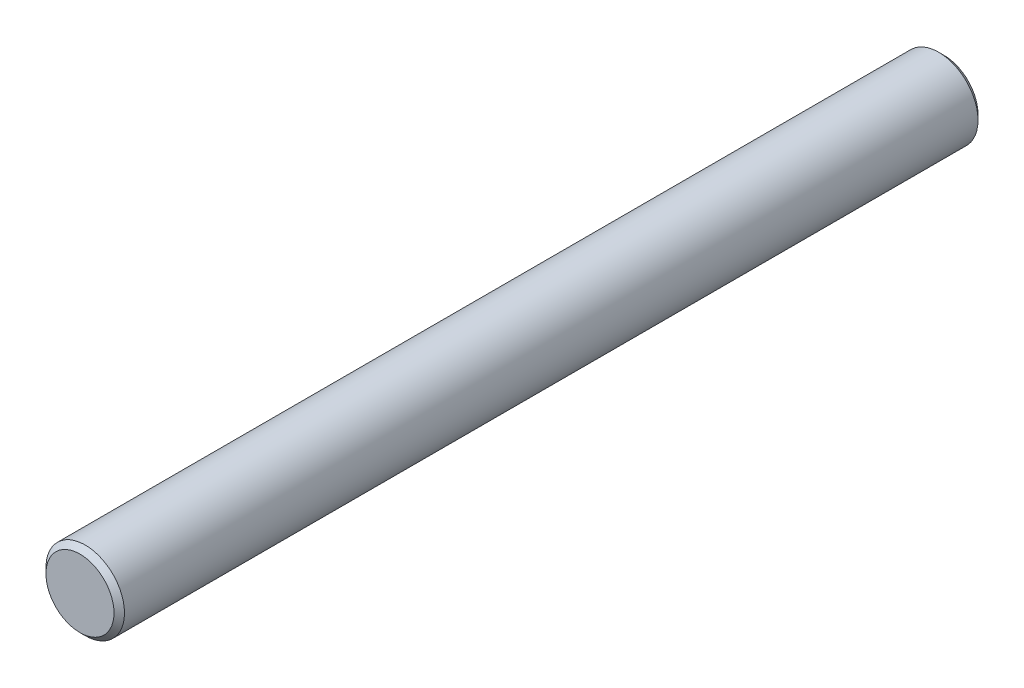
ISO-10303-21;
HEADER;
FILE_DESCRIPTION(('STEP AP214'),'2;1');
FILE_NAME('part.step','',(''),(''),'','','');
FILE_SCHEMA(('AUTOMOTIVE_DESIGN { 1 0 10303 214 1 1 1 1 }'));
ENDSEC;
DATA;
#1=APPLICATION_CONTEXT('core data for automotive mechanical design processes');
#2=APPLICATION_PROTOCOL_DEFINITION('international standard','automotive_design',2000,#1);
#3=PRODUCT_CONTEXT('',#1,'mechanical');
#4=PRODUCT('Part','Part','',(#3));
#5=PRODUCT_RELATED_PRODUCT_CATEGORY('part','',(#4));
#6=PRODUCT_DEFINITION_FORMATION('','',#4);
#7=PRODUCT_DEFINITION_CONTEXT('part definition',#1,'design');
#8=PRODUCT_DEFINITION('design','',#6,#7);
#9=PRODUCT_DEFINITION_SHAPE('','',#8);
#10=(LENGTH_UNIT() NAMED_UNIT(*) SI_UNIT(.MILLI.,.METRE.));
#11=(NAMED_UNIT(*) PLANE_ANGLE_UNIT() SI_UNIT($,.RADIAN.));
#12=(NAMED_UNIT(*) SI_UNIT($,.STERADIAN.) SOLID_ANGLE_UNIT());
#13=UNCERTAINTY_MEASURE_WITH_UNIT(LENGTH_MEASURE(1.E-05),#10,'distance_accuracy_value','');
#14=(GEOMETRIC_REPRESENTATION_CONTEXT(3) GLOBAL_UNCERTAINTY_ASSIGNED_CONTEXT((#13)) GLOBAL_UNIT_ASSIGNED_CONTEXT((#10,
#11,#12)) REPRESENTATION_CONTEXT('',''));
#15=CARTESIAN_POINT('',(0.,0.,0.));
#16=DIRECTION('',(0.,0.,1.));
#17=DIRECTION('',(1.,0.,0.));
#18=AXIS2_PLACEMENT_3D('',#15,#16,#17);
#19=CARTESIAN_POINT('',(0.,0.,33.));
#20=DIRECTION('',(0.,0.,-1.));
#21=DIRECTION('',(-1.,0.,0.));
#22=AXIS2_PLACEMENT_3D('',#19,#20,#21);
#23=CYLINDRICAL_SURFACE('',#22,1.5);
#24=CARTESIAN_POINT('',(0.,0.,0.199999999999999));
#25=DIRECTION('',(0.,0.,1.));
#26=DIRECTION('',(1.,0.,0.));
#27=AXIS2_PLACEMENT_3D('',#24,#25,#26);
#28=CIRCLE('',#27,1.5);
#29=CARTESIAN_POINT('',(1.5,0.,0.199999999999999));
#30=VERTEX_POINT('',#29);
#31=EDGE_CURVE('E42',#30,#30,#28,.T.);
#32=ORIENTED_EDGE('',*,*,#31,.T.);
#33=EDGE_LOOP('',(#32));
#34=FACE_BOUND('',#33,.T.);
#35=CARTESIAN_POINT('',(0.,0.,32.8));
#36=DIRECTION('',(0.,0.,1.));
#37=DIRECTION('',(1.,0.,0.));
#38=AXIS2_PLACEMENT_3D('',#35,#36,#37);
#39=CIRCLE('',#38,1.5);
#40=CARTESIAN_POINT('',(1.5,0.,32.8));
#41=VERTEX_POINT('',#40);
#42=EDGE_CURVE('E46',#41,#41,#39,.F.);
#43=ORIENTED_EDGE('',*,*,#42,.T.);
#44=EDGE_LOOP('',(#43));
#45=FACE_BOUND('',#44,.T.);
#46=ADVANCED_FACE('F31',(#34,#45),#23,.T.);
#47=CARTESIAN_POINT('',(0.,0.,33.));
#48=DIRECTION('',(0.,0.,1.));
#49=DIRECTION('',(1.,0.,0.));
#50=AXIS2_PLACEMENT_3D('',#47,#48,#49);
#51=PLANE('',#50);
#52=CARTESIAN_POINT('',(0.,0.,33.));
#53=DIRECTION('',(0.,0.,1.));
#54=DIRECTION('',(1.,0.,0.));
#55=AXIS2_PLACEMENT_3D('',#52,#53,#54);
#56=CIRCLE('',#55,1.3);
#57=CARTESIAN_POINT('',(1.3,0.,33.));
#58=VERTEX_POINT('',#57);
#59=EDGE_CURVE('E10',#58,#58,#56,.T.);
#60=ORIENTED_EDGE('',*,*,#59,.T.);
#61=EDGE_LOOP('',(#60));
#62=FACE_BOUND('',#61,.T.);
#63=ADVANCED_FACE('F62',(#62),#51,.T.);
#64=CARTESIAN_POINT('',(0.,0.,0.));
#65=DIRECTION('',(0.,0.,1.));
#66=DIRECTION('',(1.,0.,0.));
#67=AXIS2_PLACEMENT_3D('',#64,#65,#66);
#68=PLANE('',#67);
#69=CARTESIAN_POINT('',(0.,0.,0.));
#70=DIRECTION('',(0.,0.,1.));
#71=DIRECTION('',(1.,0.,0.));
#72=AXIS2_PLACEMENT_3D('',#69,#70,#71);
#73=CIRCLE('',#72,1.3);
#74=CARTESIAN_POINT('',(1.3,0.,0.));
#75=VERTEX_POINT('',#74);
#76=EDGE_CURVE('E38',#75,#75,#73,.F.);
#77=ORIENTED_EDGE('',*,*,#76,.T.);
#78=EDGE_LOOP('',(#77));
#79=FACE_BOUND('',#78,.T.);
#80=ADVANCED_FACE('F59',(#79),#68,.F.);
#81=CARTESIAN_POINT('',(0.,0.,0.199999999999999));
#82=DIRECTION('',(0.,0.,1.));
#83=DIRECTION('',(1.,0.,0.));
#84=AXIS2_PLACEMENT_3D('',#81,#82,#83);
#85=CONICAL_SURFACE('',#84,1.5,0.785398163397445);
#86=ORIENTED_EDGE('',*,*,#76,.F.);
#87=EDGE_LOOP('',(#86));
#88=FACE_BOUND('',#87,.T.);
#89=ORIENTED_EDGE('',*,*,#31,.F.);
#90=EDGE_LOOP('',(#89));
#91=FACE_BOUND('',#90,.T.);
#92=ADVANCED_FACE('F55',(#88,#91),#85,.T.);
#93=CARTESIAN_POINT('',(0.,0.,33.));
#94=DIRECTION('',(0.,0.,-1.));
#95=DIRECTION('',(-1.,0.,0.));
#96=AXIS2_PLACEMENT_3D('',#93,#94,#95);
#97=CONICAL_SURFACE('',#96,1.3,0.785398163397454);
#98=ORIENTED_EDGE('',*,*,#42,.F.);
#99=EDGE_LOOP('',(#98));
#100=FACE_BOUND('',#99,.T.);
#101=ORIENTED_EDGE('',*,*,#59,.F.);
#102=EDGE_LOOP('',(#101));
#103=FACE_BOUND('',#102,.T.);
#104=ADVANCED_FACE('F33',(#100,#103),#97,.T.);
#105=CLOSED_SHELL('',(#46,#63,#80,#92,#104));
#106=MANIFOLD_SOLID_BREP('B2',#105);
#107=ADVANCED_BREP_SHAPE_REPRESENTATION('',(#18,#106),#14);
#108=SHAPE_DEFINITION_REPRESENTATION(#9,#107);
ENDSEC;
END-ISO-10303-21;
